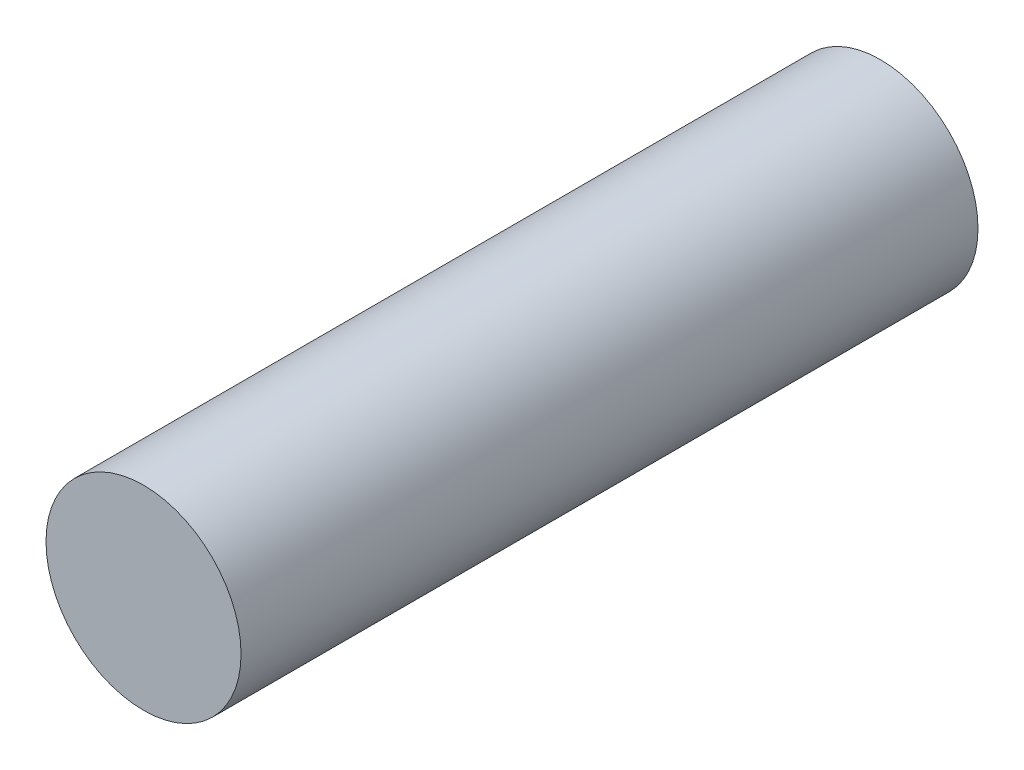
ISO-10303-21;
HEADER;
FILE_DESCRIPTION(('STEP AP214'),'2;1');
FILE_NAME('part.step','',(''),(''),'','','');
FILE_SCHEMA(('AUTOMOTIVE_DESIGN { 1 0 10303 214 1 1 1 1 }'));
ENDSEC;
DATA;
#1=APPLICATION_CONTEXT('core data for automotive mechanical design processes');
#2=APPLICATION_PROTOCOL_DEFINITION('international standard','automotive_design',2000,#1);
#3=PRODUCT_CONTEXT('',#1,'mechanical');
#4=PRODUCT('Part','Part','',(#3));
#5=PRODUCT_RELATED_PRODUCT_CATEGORY('part','',(#4));
#6=PRODUCT_DEFINITION_FORMATION('','',#4);
#7=PRODUCT_DEFINITION_CONTEXT('part definition',#1,'design');
#8=PRODUCT_DEFINITION('design','',#6,#7);
#9=PRODUCT_DEFINITION_SHAPE('','',#8);
#10=(LENGTH_UNIT() NAMED_UNIT(*) SI_UNIT(.MILLI.,.METRE.));
#11=(NAMED_UNIT(*) PLANE_ANGLE_UNIT() SI_UNIT($,.RADIAN.));
#12=(NAMED_UNIT(*) SI_UNIT($,.STERADIAN.) SOLID_ANGLE_UNIT());
#13=UNCERTAINTY_MEASURE_WITH_UNIT(LENGTH_MEASURE(1.E-05),#10,'distance_accuracy_value','');
#14=(GEOMETRIC_REPRESENTATION_CONTEXT(3) GLOBAL_UNCERTAINTY_ASSIGNED_CONTEXT((#13)) GLOBAL_UNIT_ASSIGNED_CONTEXT((#10,
#11,#12)) REPRESENTATION_CONTEXT('',''));
#15=CARTESIAN_POINT('',(0.,0.,0.));
#16=DIRECTION('',(0.,0.,1.));
#17=DIRECTION('',(1.,0.,0.));
#18=AXIS2_PLACEMENT_3D('',#15,#16,#17);
#19=CARTESIAN_POINT('',(0.,0.,60.));
#20=DIRECTION('',(0.,0.,-1.));
#21=DIRECTION('',(-1.,0.,0.));
#22=AXIS2_PLACEMENT_3D('',#19,#20,#21);
#23=CYLINDRICAL_SURFACE('',#22,7.94);
#24=CARTESIAN_POINT('',(0.,0.,60.));
#25=DIRECTION('',(0.,0.,1.));
#26=DIRECTION('',(1.,0.,0.));
#27=AXIS2_PLACEMENT_3D('',#24,#25,#26);
#28=CIRCLE('',#27,7.94);
#29=CARTESIAN_POINT('',(7.94,0.,60.));
#30=VERTEX_POINT('',#29);
#31=EDGE_CURVE('E10',#30,#30,#28,.T.);
#32=ORIENTED_EDGE('',*,*,#31,.F.);
#33=EDGE_LOOP('',(#32));
#34=FACE_BOUND('',#33,.T.);
#35=CARTESIAN_POINT('',(0.,0.,0.));
#36=DIRECTION('',(0.,0.,1.));
#37=DIRECTION('',(1.,0.,0.));
#38=AXIS2_PLACEMENT_3D('',#35,#36,#37);
#39=CIRCLE('',#38,7.94);
#40=CARTESIAN_POINT('',(7.94,0.,0.));
#41=VERTEX_POINT('',#40);
#42=EDGE_CURVE('E38',#41,#41,#39,.T.);
#43=ORIENTED_EDGE('',*,*,#42,.T.);
#44=EDGE_LOOP('',(#43));
#45=FACE_BOUND('',#44,.T.);
#46=ADVANCED_FACE('F35',(#34,#45),#23,.T.);
#47=CARTESIAN_POINT('',(0.,0.,60.));
#48=DIRECTION('',(0.,0.,1.));
#49=DIRECTION('',(1.,0.,0.));
#50=AXIS2_PLACEMENT_3D('',#47,#48,#49);
#51=PLANE('',#50);
#52=ORIENTED_EDGE('',*,*,#31,.T.);
#53=EDGE_LOOP('',(#52));
#54=FACE_BOUND('',#53,.T.);
#55=ADVANCED_FACE('F50',(#54),#51,.T.);
#56=CARTESIAN_POINT('',(0.,0.,0.));
#57=DIRECTION('',(0.,0.,1.));
#58=DIRECTION('',(1.,0.,0.));
#59=AXIS2_PLACEMENT_3D('',#56,#57,#58);
#60=PLANE('',#59);
#61=ORIENTED_EDGE('',*,*,#42,.F.);
#62=EDGE_LOOP('',(#61));
#63=FACE_BOUND('',#62,.T.);
#64=ADVANCED_FACE('F48',(#63),#60,.F.);
#65=CLOSED_SHELL('',(#46,#55,#64));
#66=MANIFOLD_SOLID_BREP('B2',#65);
#67=ADVANCED_BREP_SHAPE_REPRESENTATION('',(#18,#66),#14);
#68=SHAPE_DEFINITION_REPRESENTATION(#9,#67);
ENDSEC;
END-ISO-10303-21;
